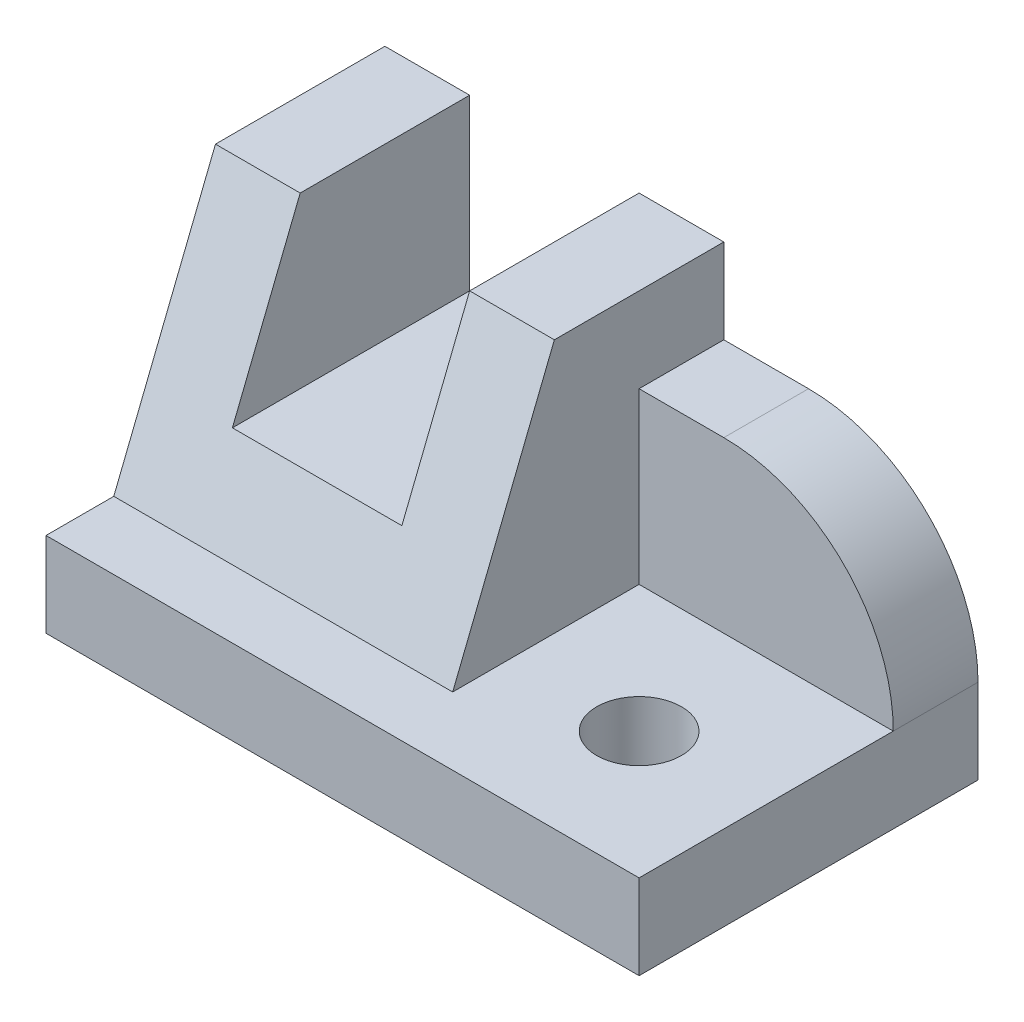
ISO-10303-21;
HEADER;
FILE_DESCRIPTION(('STEP AP214'),'2;1');
FILE_NAME('part.step','',(''),(''),'','','');
FILE_SCHEMA(('AUTOMOTIVE_DESIGN { 1 0 10303 214 1 1 1 1 }'));
ENDSEC;
DATA;
#1=APPLICATION_CONTEXT('core data for automotive mechanical design processes');
#2=APPLICATION_PROTOCOL_DEFINITION('international standard','automotive_design',2000,#1);
#3=PRODUCT_CONTEXT('',#1,'mechanical');
#4=PRODUCT('Part','Part','',(#3));
#5=PRODUCT_RELATED_PRODUCT_CATEGORY('part','',(#4));
#6=PRODUCT_DEFINITION_FORMATION('','',#4);
#7=PRODUCT_DEFINITION_CONTEXT('part definition',#1,'design');
#8=PRODUCT_DEFINITION('design','',#6,#7);
#9=PRODUCT_DEFINITION_SHAPE('','',#8);
#10=(LENGTH_UNIT() NAMED_UNIT(*) SI_UNIT(.MILLI.,.METRE.));
#11=(NAMED_UNIT(*) PLANE_ANGLE_UNIT() SI_UNIT($,.RADIAN.));
#12=(NAMED_UNIT(*) SI_UNIT($,.STERADIAN.) SOLID_ANGLE_UNIT());
#13=UNCERTAINTY_MEASURE_WITH_UNIT(LENGTH_MEASURE(1.E-05),#10,'distance_accuracy_value','');
#14=(GEOMETRIC_REPRESENTATION_CONTEXT(3) GLOBAL_UNCERTAINTY_ASSIGNED_CONTEXT((#13)) GLOBAL_UNIT_ASSIGNED_CONTEXT((#10,
#11,#12)) REPRESENTATION_CONTEXT('',''));
#15=CARTESIAN_POINT('',(0.,0.,0.));
#16=DIRECTION('',(0.,0.,1.));
#17=DIRECTION('',(1.,0.,0.));
#18=AXIS2_PLACEMENT_3D('',#15,#16,#17);
#19=CARTESIAN_POINT('',(40.,40.,-40.));
#20=DIRECTION('',(0.,-1.,0.));
#21=DIRECTION('',(0.,0.,-1.));
#22=AXIS2_PLACEMENT_3D('',#19,#20,#21);
#23=PLANE('',#22);
#24=DIRECTION('',(-1.,0.,0.));
#25=VECTOR('',#24,1.);
#26=CARTESIAN_POINT('',(40.,40.,-20.));
#27=LINE('',#26,#25);
#28=CARTESIAN_POINT('',(9.99999999999998,40.,-20.));
#29=VERTEX_POINT('',#28);
#30=CARTESIAN_POINT('',(0.,40.,-20.));
#31=VERTEX_POINT('',#30);
#32=EDGE_CURVE('E235',#29,#31,#27,.T.);
#33=ORIENTED_EDGE('',*,*,#32,.F.);
#34=DIRECTION('',(0.,0.,-1.));
#35=VECTOR('',#34,1.);
#36=CARTESIAN_POINT('',(9.99999999999998,40.,0.));
#37=LINE('',#36,#35);
#38=CARTESIAN_POINT('',(9.99999999999999,40.,-40.));
#39=VERTEX_POINT('',#38);
#40=EDGE_CURVE('E160',#29,#39,#37,.T.);
#41=ORIENTED_EDGE('',*,*,#40,.T.);
#42=DIRECTION('',(1.,0.,0.));
#43=VECTOR('',#42,1.);
#44=CARTESIAN_POINT('',(40.,40.,-40.));
#45=LINE('',#44,#43);
#46=CARTESIAN_POINT('',(0.,40.,-40.));
#47=VERTEX_POINT('',#46);
#48=EDGE_CURVE('E219',#47,#39,#45,.T.);
#49=ORIENTED_EDGE('',*,*,#48,.F.);
#50=DIRECTION('',(0.,0.,1.));
#51=VECTOR('',#50,1.);
#52=CARTESIAN_POINT('',(0.,40.,-40.));
#53=LINE('',#52,#51);
#54=EDGE_CURVE('E221',#47,#31,#53,.T.);
#55=ORIENTED_EDGE('',*,*,#54,.T.);
#56=EDGE_LOOP('',(#33,#41,#49,#55));
#57=FACE_BOUND('',#56,.T.);
#58=ADVANCED_FACE('F35',(#57),#23,.F.);
#59=CARTESIAN_POINT('',(40.,10.,-8.00000000000001));
#60=DIRECTION('',(0.,0.371390676354104,0.928476690885259));
#61=DIRECTION('',(0.,-0.928476690885259,0.371390676354104));
#62=AXIS2_PLACEMENT_3D('',#59,#60,#61);
#63=PLANE('',#62);
#64=DIRECTION('',(0.,-0.928476690885259,0.371390676354104));
#65=VECTOR('',#64,1.);
#66=CARTESIAN_POINT('',(9.99999999999998,10.,-8.00000000000001));
#67=LINE('',#66,#65);
#68=CARTESIAN_POINT('',(9.99999999999998,20.,-12.));
#69=VERTEX_POINT('',#68);
#70=EDGE_CURVE('E168',#29,#69,#67,.T.);
#71=ORIENTED_EDGE('',*,*,#70,.F.);
#72=ORIENTED_EDGE('',*,*,#32,.T.);
#73=DIRECTION('',(0.,0.928476690885259,-0.371390676354104));
#74=VECTOR('',#73,1.);
#75=CARTESIAN_POINT('',(0.,10.,-8.00000000000001));
#76=LINE('',#75,#74);
#77=CARTESIAN_POINT('',(0.,10.,-8.00000000000001));
#78=VERTEX_POINT('',#77);
#79=EDGE_CURVE('E224',#78,#31,#76,.T.);
#80=ORIENTED_EDGE('',*,*,#79,.F.);
#81=DIRECTION('',(-1.,0.,0.));
#82=VECTOR('',#81,1.);
#83=CARTESIAN_POINT('',(40.,10.,-8.00000000000001));
#84=LINE('',#83,#82);
#85=CARTESIAN_POINT('',(40.,10.,-8.00000000000001));
#86=VERTEX_POINT('',#85);
#87=EDGE_CURVE('E228',#86,#78,#84,.T.);
#88=ORIENTED_EDGE('',*,*,#87,.F.);
#89=DIRECTION('',(0.,0.928476690885259,-0.371390676354104));
#90=VECTOR('',#89,1.);
#91=CARTESIAN_POINT('',(40.,10.,-8.00000000000001));
#92=LINE('',#91,#90);
#93=CARTESIAN_POINT('',(40.,40.,-20.));
#94=VERTEX_POINT('',#93);
#95=EDGE_CURVE('E225',#86,#94,#92,.T.);
#96=ORIENTED_EDGE('',*,*,#95,.T.);
#97=CARTESIAN_POINT('',(30.,40.,-20.));
#98=VERTEX_POINT('',#97);
#99=EDGE_CURVE('E231',#94,#98,#27,.T.);
#100=ORIENTED_EDGE('',*,*,#99,.T.);
#101=DIRECTION('',(0.,0.928476690885259,-0.371390676354104));
#102=VECTOR('',#101,1.);
#103=CARTESIAN_POINT('',(30.,10.,-8.00000000000001));
#104=LINE('',#103,#102);
#105=CARTESIAN_POINT('',(30.,20.,-12.));
#106=VERTEX_POINT('',#105);
#107=EDGE_CURVE('E163',#106,#98,#104,.T.);
#108=ORIENTED_EDGE('',*,*,#107,.F.);
#109=DIRECTION('',(1.,0.,0.));
#110=VECTOR('',#109,1.);
#111=CARTESIAN_POINT('',(40.,20.,-12.));
#112=LINE('',#111,#110);
#113=EDGE_CURVE('E140',#69,#106,#112,.T.);
#114=ORIENTED_EDGE('',*,*,#113,.F.);
#115=EDGE_LOOP('',(#71,#72,#80,#88,#96,#100,#108,#114));
#116=FACE_BOUND('',#115,.T.);
#117=ADVANCED_FACE('F270',(#116),#63,.T.);
#118=CARTESIAN_POINT('',(0.,0.,0.));
#119=DIRECTION('',(1.,0.,0.));
#120=DIRECTION('',(0.,0.,-1.));
#121=AXIS2_PLACEMENT_3D('',#118,#119,#120);
#122=PLANE('',#121);
#123=DIRECTION('',(0.,1.,0.));
#124=VECTOR('',#123,1.);
#125=CARTESIAN_POINT('',(0.,40.,-40.));
#126=LINE('',#125,#124);
#127=CARTESIAN_POINT('',(0.,0.,-40.));
#128=VERTEX_POINT('',#127);
#129=EDGE_CURVE('E216',#128,#47,#126,.T.);
#130=ORIENTED_EDGE('',*,*,#129,.F.);
#131=DIRECTION('',(0.,0.,-1.));
#132=VECTOR('',#131,1.);
#133=CARTESIAN_POINT('',(0.,0.,-40.));
#134=LINE('',#133,#132);
#135=CARTESIAN_POINT('',(0.,0.,0.));
#136=VERTEX_POINT('',#135);
#137=EDGE_CURVE('E174',#136,#128,#134,.T.);
#138=ORIENTED_EDGE('',*,*,#137,.F.);
#139=DIRECTION('',(0.,1.,0.));
#140=VECTOR('',#139,1.);
#141=CARTESIAN_POINT('',(0.,0.,0.));
#142=LINE('',#141,#140);
#143=CARTESIAN_POINT('',(0.,10.,0.));
#144=VERTEX_POINT('',#143);
#145=EDGE_CURVE('E192',#136,#144,#142,.T.);
#146=ORIENTED_EDGE('',*,*,#145,.T.);
#147=DIRECTION('',(0.,0.,-1.));
#148=VECTOR('',#147,1.);
#149=CARTESIAN_POINT('',(0.,10.,-40.));
#150=LINE('',#149,#148);
#151=EDGE_CURVE('E186',#144,#78,#150,.T.);
#152=ORIENTED_EDGE('',*,*,#151,.T.);
#153=ORIENTED_EDGE('',*,*,#79,.T.);
#154=ORIENTED_EDGE('',*,*,#54,.F.);
#155=EDGE_LOOP('',(#130,#138,#146,#152,#153,#154));
#156=FACE_BOUND('',#155,.T.);
#157=ADVANCED_FACE('F273',(#156),#122,.F.);
#158=CARTESIAN_POINT('',(30.,40.,-40.));
#159=VERTEX_POINT('',#158);
#160=CARTESIAN_POINT('',(40.,40.,-40.));
#161=VERTEX_POINT('',#160);
#162=EDGE_CURVE('E218',#159,#161,#45,.T.);
#163=ORIENTED_EDGE('',*,*,#162,.F.);
#164=DIRECTION('',(0.,0.,-1.));
#165=VECTOR('',#164,1.);
#166=CARTESIAN_POINT('',(30.,40.,0.));
#167=LINE('',#166,#165);
#168=EDGE_CURVE('E144',#98,#159,#167,.T.);
#169=ORIENTED_EDGE('',*,*,#168,.F.);
#170=ORIENTED_EDGE('',*,*,#99,.F.);
#171=DIRECTION('',(0.,0.,1.));
#172=VECTOR('',#171,1.);
#173=CARTESIAN_POINT('',(40.,40.,-40.));
#174=LINE('',#173,#172);
#175=EDGE_CURVE('E195',#161,#94,#174,.T.);
#176=ORIENTED_EDGE('',*,*,#175,.F.);
#177=EDGE_LOOP('',(#163,#169,#170,#176));
#178=FACE_BOUND('',#177,.T.);
#179=ADVANCED_FACE('F267',(#178),#23,.F.);
#180=CARTESIAN_POINT('',(0.,0.,-40.));
#181=DIRECTION('',(0.,0.,1.));
#182=DIRECTION('',(0.,-1.,0.));
#183=AXIS2_PLACEMENT_3D('',#180,#181,#182);
#184=PLANE('',#183);
#185=DIRECTION('',(1.,0.,0.));
#186=VECTOR('',#185,1.);
#187=CARTESIAN_POINT('',(40.,30.,-40.));
#188=LINE('',#187,#186);
#189=CARTESIAN_POINT('',(40.,30.,-40.));
#190=VERTEX_POINT('',#189);
#191=CARTESIAN_POINT('',(50.,30.,-40.));
#192=VERTEX_POINT('',#191);
#193=EDGE_CURVE('E209',#190,#192,#188,.T.);
#194=ORIENTED_EDGE('',*,*,#193,.T.);
#195=CARTESIAN_POINT('',(50.,9.99999999999999,-40.));
#196=DIRECTION('',(0.,0.,1.));
#197=DIRECTION('',(0.,-1.,0.));
#198=AXIS2_PLACEMENT_3D('',#195,#196,#197);
#199=CIRCLE('',#198,20.);
#200=CARTESIAN_POINT('',(70.,10.,-40.));
#201=VERTEX_POINT('',#200);
#202=EDGE_CURVE('E50',#192,#201,#199,.F.);
#203=ORIENTED_EDGE('',*,*,#202,.T.);
#204=DIRECTION('',(0.,1.,0.));
#205=VECTOR('',#204,1.);
#206=CARTESIAN_POINT('',(70.,40.,-40.));
#207=LINE('',#206,#205);
#208=CARTESIAN_POINT('',(70.,0.,-40.));
#209=VERTEX_POINT('',#208);
#210=EDGE_CURVE('E211',#209,#201,#207,.T.);
#211=ORIENTED_EDGE('',*,*,#210,.F.);
#212=DIRECTION('',(1.,0.,0.));
#213=VECTOR('',#212,1.);
#214=CARTESIAN_POINT('',(70.,0.,-40.));
#215=LINE('',#214,#213);
#216=EDGE_CURVE('E178',#128,#209,#215,.T.);
#217=ORIENTED_EDGE('',*,*,#216,.F.);
#218=ORIENTED_EDGE('',*,*,#129,.T.);
#219=ORIENTED_EDGE('',*,*,#48,.T.);
#220=DIRECTION('',(0.,1.,0.));
#221=VECTOR('',#220,1.);
#222=CARTESIAN_POINT('',(9.99999999999999,20.,-40.));
#223=LINE('',#222,#221);
#224=CARTESIAN_POINT('',(9.99999999999999,20.,-40.));
#225=VERTEX_POINT('',#224);
#226=EDGE_CURVE('E155',#225,#39,#223,.T.);
#227=ORIENTED_EDGE('',*,*,#226,.F.);
#228=DIRECTION('',(-1.,0.,0.));
#229=VECTOR('',#228,1.);
#230=CARTESIAN_POINT('',(30.,20.,-40.));
#231=LINE('',#230,#229);
#232=CARTESIAN_POINT('',(30.,20.,-40.));
#233=VERTEX_POINT('',#232);
#234=EDGE_CURVE('E137',#233,#225,#231,.T.);
#235=ORIENTED_EDGE('',*,*,#234,.F.);
#236=DIRECTION('',(0.,-1.,0.));
#237=VECTOR('',#236,1.);
#238=CARTESIAN_POINT('',(30.,40.,-40.));
#239=LINE('',#238,#237);
#240=EDGE_CURVE('E147',#159,#233,#239,.T.);
#241=ORIENTED_EDGE('',*,*,#240,.F.);
#242=ORIENTED_EDGE('',*,*,#162,.T.);
#243=DIRECTION('',(0.,1.,0.));
#244=VECTOR('',#243,1.);
#245=CARTESIAN_POINT('',(40.,30.,-40.));
#246=LINE('',#245,#244);
#247=EDGE_CURVE('E205',#190,#161,#246,.T.);
#248=ORIENTED_EDGE('',*,*,#247,.F.);
#249=EDGE_LOOP('',(#194,#203,#211,#217,#218,#219,#227,#235,#241,#242,#248));
#250=FACE_BOUND('',#249,.T.);
#251=ADVANCED_FACE('F153',(#250),#184,.F.);
#252=CARTESIAN_POINT('',(70.,0.,0.));
#253=DIRECTION('',(-1.,0.,0.));
#254=DIRECTION('',(0.,0.,1.));
#255=AXIS2_PLACEMENT_3D('',#252,#253,#254);
#256=PLANE('',#255);
#257=ORIENTED_EDGE('',*,*,#210,.T.);
#258=DIRECTION('',(0.,0.,-1.));
#259=VECTOR('',#258,1.);
#260=CARTESIAN_POINT('',(70.,9.99999999999999,0.));
#261=LINE('',#260,#259);
#262=CARTESIAN_POINT('',(70.,10.,-30.));
#263=VERTEX_POINT('',#262);
#264=EDGE_CURVE('E43',#201,#263,#261,.F.);
#265=ORIENTED_EDGE('',*,*,#264,.T.);
#266=DIRECTION('',(0.,0.,1.));
#267=VECTOR('',#266,1.);
#268=CARTESIAN_POINT('',(70.,10.,0.));
#269=LINE('',#268,#267);
#270=CARTESIAN_POINT('',(70.,10.,0.));
#271=VERTEX_POINT('',#270);
#272=EDGE_CURVE('E175',#263,#271,#269,.T.);
#273=ORIENTED_EDGE('',*,*,#272,.T.);
#274=DIRECTION('',(0.,1.,0.));
#275=VECTOR('',#274,1.);
#276=CARTESIAN_POINT('',(70.,0.,0.));
#277=LINE('',#276,#275);
#278=CARTESIAN_POINT('',(70.,0.,0.));
#279=VERTEX_POINT('',#278);
#280=EDGE_CURVE('E183',#279,#271,#277,.T.);
#281=ORIENTED_EDGE('',*,*,#280,.F.);
#282=DIRECTION('',(0.,0.,1.));
#283=VECTOR('',#282,1.);
#284=CARTESIAN_POINT('',(70.,0.,0.));
#285=LINE('',#284,#283);
#286=EDGE_CURVE('E181',#209,#279,#285,.T.);
#287=ORIENTED_EDGE('',*,*,#286,.F.);
#288=EDGE_LOOP('',(#257,#265,#273,#281,#287));
#289=FACE_BOUND('',#288,.T.);
#290=ADVANCED_FACE('F245',(#289),#256,.F.);
#291=CARTESIAN_POINT('',(40.,30.,-30.));
#292=DIRECTION('',(0.,-1.,0.));
#293=DIRECTION('',(0.,0.,-1.));
#294=AXIS2_PLACEMENT_3D('',#291,#292,#293);
#295=PLANE('',#294);
#296=DIRECTION('',(1.,0.,0.));
#297=VECTOR('',#296,1.);
#298=CARTESIAN_POINT('',(40.,30.,-30.));
#299=LINE('',#298,#297);
#300=CARTESIAN_POINT('',(40.,30.,-30.));
#301=VERTEX_POINT('',#300);
#302=CARTESIAN_POINT('',(50.,30.,-30.));
#303=VERTEX_POINT('',#302);
#304=EDGE_CURVE('E212',#301,#303,#299,.T.);
#305=ORIENTED_EDGE('',*,*,#304,.T.);
#306=DIRECTION('',(0.,0.,-1.));
#307=VECTOR('',#306,1.);
#308=CARTESIAN_POINT('',(50.,30.,-30.));
#309=LINE('',#308,#307);
#310=EDGE_CURVE('E234',#303,#192,#309,.T.);
#311=ORIENTED_EDGE('',*,*,#310,.T.);
#312=ORIENTED_EDGE('',*,*,#193,.F.);
#313=DIRECTION('',(0.,0.,-1.));
#314=VECTOR('',#313,1.);
#315=CARTESIAN_POINT('',(40.,30.,-30.));
#316=LINE('',#315,#314);
#317=EDGE_CURVE('E202',#301,#190,#316,.T.);
#318=ORIENTED_EDGE('',*,*,#317,.F.);
#319=EDGE_LOOP('',(#305,#311,#312,#318));
#320=FACE_BOUND('',#319,.T.);
#321=ADVANCED_FACE('F259',(#320),#295,.F.);
#322=CARTESIAN_POINT('',(40.,10.,-30.));
#323=DIRECTION('',(0.,0.,-1.));
#324=DIRECTION('',(-1.,0.,0.));
#325=AXIS2_PLACEMENT_3D('',#322,#323,#324);
#326=PLANE('',#325);
#327=DIRECTION('',(1.,0.,0.));
#328=VECTOR('',#327,1.);
#329=CARTESIAN_POINT('',(40.,10.,-30.));
#330=LINE('',#329,#328);
#331=CARTESIAN_POINT('',(40.,10.,-30.));
#332=VERTEX_POINT('',#331);
#333=EDGE_CURVE('E208',#332,#263,#330,.T.);
#334=ORIENTED_EDGE('',*,*,#333,.T.);
#335=CARTESIAN_POINT('',(50.,9.99999999999999,-30.));
#336=DIRECTION('',(0.,0.,-1.));
#337=DIRECTION('',(-1.,0.,0.));
#338=AXIS2_PLACEMENT_3D('',#335,#336,#337);
#339=CIRCLE('',#338,20.);
#340=EDGE_CURVE('E11',#263,#303,#339,.F.);
#341=ORIENTED_EDGE('',*,*,#340,.T.);
#342=ORIENTED_EDGE('',*,*,#304,.F.);
#343=DIRECTION('',(0.,1.,0.));
#344=VECTOR('',#343,1.);
#345=CARTESIAN_POINT('',(40.,10.,-30.));
#346=LINE('',#345,#344);
#347=EDGE_CURVE('E199',#332,#301,#346,.T.);
#348=ORIENTED_EDGE('',*,*,#347,.F.);
#349=EDGE_LOOP('',(#334,#341,#342,#348));
#350=FACE_BOUND('',#349,.T.);
#351=ADVANCED_FACE('F252',(#350),#326,.F.);
#352=CARTESIAN_POINT('',(40.,0.,0.));
#353=DIRECTION('',(-1.,0.,0.));
#354=DIRECTION('',(0.,0.,1.));
#355=AXIS2_PLACEMENT_3D('',#352,#353,#354);
#356=PLANE('',#355);
#357=ORIENTED_EDGE('',*,*,#95,.F.);
#358=DIRECTION('',(0.,0.,-1.));
#359=VECTOR('',#358,1.);
#360=CARTESIAN_POINT('',(40.,10.,0.));
#361=LINE('',#360,#359);
#362=EDGE_CURVE('E197',#86,#332,#361,.T.);
#363=ORIENTED_EDGE('',*,*,#362,.T.);
#364=ORIENTED_EDGE('',*,*,#347,.T.);
#365=ORIENTED_EDGE('',*,*,#317,.T.);
#366=ORIENTED_EDGE('',*,*,#247,.T.);
#367=ORIENTED_EDGE('',*,*,#175,.T.);
#368=EDGE_LOOP('',(#357,#363,#364,#365,#366,#367));
#369=FACE_BOUND('',#368,.T.);
#370=ADVANCED_FACE('F264',(#369),#356,.F.);
#371=CARTESIAN_POINT('',(0.,10.,0.));
#372=DIRECTION('',(0.,1.,0.));
#373=DIRECTION('',(0.,0.,1.));
#374=AXIS2_PLACEMENT_3D('',#371,#372,#373);
#375=PLANE('',#374);
#376=CARTESIAN_POINT('',(55.,10.,-15.));
#377=DIRECTION('',(0.,1.,0.));
#378=DIRECTION('',(0.,0.,1.));
#379=AXIS2_PLACEMENT_3D('',#376,#377,#378);
#380=CIRCLE('',#379,4.99999999999998);
#381=CARTESIAN_POINT('',(55.,10.,-10.));
#382=VERTEX_POINT('',#381);
#383=EDGE_CURVE('E151',#382,#382,#380,.T.);
#384=ORIENTED_EDGE('',*,*,#383,.F.);
#385=EDGE_LOOP('',(#384));
#386=FACE_BOUND('',#385,.T.);
#387=ORIENTED_EDGE('',*,*,#333,.F.);
#388=ORIENTED_EDGE('',*,*,#362,.F.);
#389=ORIENTED_EDGE('',*,*,#87,.T.);
#390=ORIENTED_EDGE('',*,*,#151,.F.);
#391=DIRECTION('',(-1.,0.,0.));
#392=VECTOR('',#391,1.);
#393=CARTESIAN_POINT('',(0.,10.,0.));
#394=LINE('',#393,#392);
#395=EDGE_CURVE('E170',#271,#144,#394,.T.);
#396=ORIENTED_EDGE('',*,*,#395,.F.);
#397=ORIENTED_EDGE('',*,*,#272,.F.);
#398=EDGE_LOOP('',(#387,#388,#389,#390,#396,#397));
#399=FACE_BOUND('',#398,.T.);
#400=ADVANCED_FACE('F256',(#386,#399),#375,.T.);
#401=CARTESIAN_POINT('',(0.,0.,0.));
#402=DIRECTION('',(0.,0.,-1.));
#403=DIRECTION('',(-1.,0.,0.));
#404=AXIS2_PLACEMENT_3D('',#401,#402,#403);
#405=PLANE('',#404);
#406=ORIENTED_EDGE('',*,*,#395,.T.);
#407=ORIENTED_EDGE('',*,*,#145,.F.);
#408=DIRECTION('',(-1.,0.,0.));
#409=VECTOR('',#408,1.);
#410=CARTESIAN_POINT('',(0.,0.,0.));
#411=LINE('',#410,#409);
#412=EDGE_CURVE('E171',#279,#136,#411,.T.);
#413=ORIENTED_EDGE('',*,*,#412,.F.);
#414=ORIENTED_EDGE('',*,*,#280,.T.);
#415=EDGE_LOOP('',(#406,#407,#413,#414));
#416=FACE_BOUND('',#415,.T.);
#417=ADVANCED_FACE('F278',(#416),#405,.F.);
#418=CARTESIAN_POINT('',(0.,0.,0.));
#419=DIRECTION('',(0.,1.,0.));
#420=DIRECTION('',(0.,0.,1.));
#421=AXIS2_PLACEMENT_3D('',#418,#419,#420);
#422=PLANE('',#421);
#423=CARTESIAN_POINT('',(55.,0.,-15.));
#424=DIRECTION('',(0.,-1.,0.));
#425=DIRECTION('',(0.,0.,-1.));
#426=AXIS2_PLACEMENT_3D('',#423,#424,#425);
#427=CIRCLE('',#426,4.99999999999998);
#428=CARTESIAN_POINT('',(55.,0.,-20.));
#429=VERTEX_POINT('',#428);
#430=EDGE_CURVE('E240',#429,#429,#427,.T.);
#431=ORIENTED_EDGE('',*,*,#430,.F.);
#432=EDGE_LOOP('',(#431));
#433=FACE_BOUND('',#432,.T.);
#434=ORIENTED_EDGE('',*,*,#412,.T.);
#435=ORIENTED_EDGE('',*,*,#137,.T.);
#436=ORIENTED_EDGE('',*,*,#216,.T.);
#437=ORIENTED_EDGE('',*,*,#286,.T.);
#438=EDGE_LOOP('',(#434,#435,#436,#437));
#439=FACE_BOUND('',#438,.T.);
#440=ADVANCED_FACE('F280',(#433,#439),#422,.F.);
#441=CARTESIAN_POINT('',(9.99999999999998,20.,0.));
#442=DIRECTION('',(-1.,0.,0.));
#443=DIRECTION('',(0.,0.,1.));
#444=AXIS2_PLACEMENT_3D('',#441,#442,#443);
#445=PLANE('',#444);
#446=ORIENTED_EDGE('',*,*,#70,.T.);
#447=DIRECTION('',(0.,0.,-1.));
#448=VECTOR('',#447,1.);
#449=CARTESIAN_POINT('',(9.99999999999998,20.,0.));
#450=LINE('',#449,#448);
#451=EDGE_CURVE('E143',#69,#225,#450,.T.);
#452=ORIENTED_EDGE('',*,*,#451,.T.);
#453=ORIENTED_EDGE('',*,*,#226,.T.);
#454=ORIENTED_EDGE('',*,*,#40,.F.);
#455=EDGE_LOOP('',(#446,#452,#453,#454));
#456=FACE_BOUND('',#455,.T.);
#457=ADVANCED_FACE('F286',(#456),#445,.F.);
#458=CARTESIAN_POINT('',(30.,20.,0.));
#459=DIRECTION('',(0.,-1.,0.));
#460=DIRECTION('',(0.,0.,-1.));
#461=AXIS2_PLACEMENT_3D('',#458,#459,#460);
#462=PLANE('',#461);
#463=ORIENTED_EDGE('',*,*,#113,.T.);
#464=DIRECTION('',(0.,0.,-1.));
#465=VECTOR('',#464,1.);
#466=CARTESIAN_POINT('',(30.,20.,0.));
#467=LINE('',#466,#465);
#468=EDGE_CURVE('E132',#106,#233,#467,.T.);
#469=ORIENTED_EDGE('',*,*,#468,.T.);
#470=ORIENTED_EDGE('',*,*,#234,.T.);
#471=ORIENTED_EDGE('',*,*,#451,.F.);
#472=EDGE_LOOP('',(#463,#469,#470,#471));
#473=FACE_BOUND('',#472,.T.);
#474=ADVANCED_FACE('F134',(#473),#462,.F.);
#475=CARTESIAN_POINT('',(30.,40.,0.));
#476=DIRECTION('',(1.,0.,0.));
#477=DIRECTION('',(0.,0.,-1.));
#478=AXIS2_PLACEMENT_3D('',#475,#476,#477);
#479=PLANE('',#478);
#480=ORIENTED_EDGE('',*,*,#107,.T.);
#481=ORIENTED_EDGE('',*,*,#168,.T.);
#482=ORIENTED_EDGE('',*,*,#240,.T.);
#483=ORIENTED_EDGE('',*,*,#468,.F.);
#484=EDGE_LOOP('',(#480,#481,#482,#483));
#485=FACE_BOUND('',#484,.T.);
#486=ADVANCED_FACE('F148',(#485),#479,.F.);
#487=CARTESIAN_POINT('',(55.,0.,-15.));
#488=DIRECTION('',(0.,-1.,0.));
#489=DIRECTION('',(0.,0.,-1.));
#490=AXIS2_PLACEMENT_3D('',#487,#488,#489);
#491=CYLINDRICAL_SURFACE('',#490,4.99999999999998);
#492=ORIENTED_EDGE('',*,*,#383,.T.);
#493=EDGE_LOOP('',(#492));
#494=FACE_BOUND('',#493,.T.);
#495=ORIENTED_EDGE('',*,*,#430,.T.);
#496=EDGE_LOOP('',(#495));
#497=FACE_BOUND('',#496,.T.);
#498=ADVANCED_FACE('F346',(#494,#497),#491,.F.);
#499=CARTESIAN_POINT('',(50.,9.99999999999999,-30.));
#500=DIRECTION('',(0.,0.,-1.));
#501=DIRECTION('',(-1.,0.,0.));
#502=AXIS2_PLACEMENT_3D('',#499,#500,#501);
#503=CYLINDRICAL_SURFACE('',#502,20.);
#504=ORIENTED_EDGE('',*,*,#340,.F.);
#505=ORIENTED_EDGE('',*,*,#264,.F.);
#506=ORIENTED_EDGE('',*,*,#202,.F.);
#507=ORIENTED_EDGE('',*,*,#310,.F.);
#508=EDGE_LOOP('',(#504,#505,#506,#507));
#509=FACE_BOUND('',#508,.T.);
#510=ADVANCED_FACE('F37',(#509),#503,.T.);
#511=CLOSED_SHELL('',(#58,#117,#157,#179,#251,#290,#321,#351,#370,#400,#417,#440,#457,#474,#486,
#498,#510));
#512=MANIFOLD_SOLID_BREP('B2',#511);
#513=ADVANCED_BREP_SHAPE_REPRESENTATION('',(#18,#512),#14);
#514=SHAPE_DEFINITION_REPRESENTATION(#9,#513);
ENDSEC;
END-ISO-10303-21;
